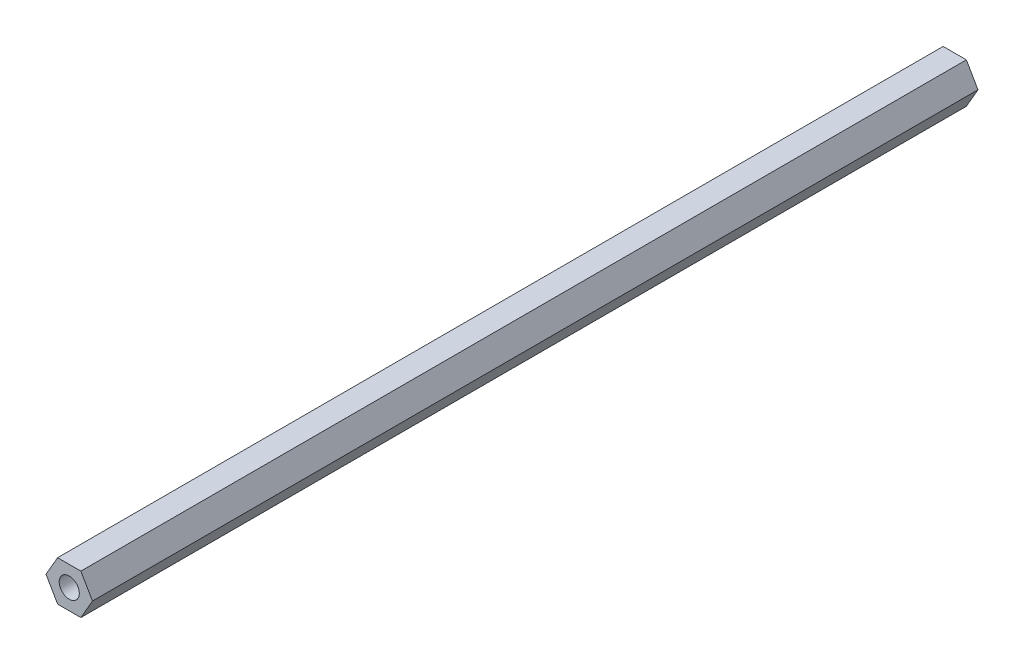
ISO-10303-21;
HEADER;
FILE_DESCRIPTION(('STEP AP214'),'2;1');
FILE_NAME('part.step','',(''),(''),'','','');
FILE_SCHEMA(('AUTOMOTIVE_DESIGN { 1 0 10303 214 1 1 1 1 }'));
ENDSEC;
DATA;
#1=APPLICATION_CONTEXT('core data for automotive mechanical design processes');
#2=APPLICATION_PROTOCOL_DEFINITION('international standard','automotive_design',2000,#1);
#3=PRODUCT_CONTEXT('',#1,'mechanical');
#4=PRODUCT('Part','Part','',(#3));
#5=PRODUCT_RELATED_PRODUCT_CATEGORY('part','',(#4));
#6=PRODUCT_DEFINITION_FORMATION('','',#4);
#7=PRODUCT_DEFINITION_CONTEXT('part definition',#1,'design');
#8=PRODUCT_DEFINITION('design','',#6,#7);
#9=PRODUCT_DEFINITION_SHAPE('','',#8);
#10=(LENGTH_UNIT() NAMED_UNIT(*) SI_UNIT(.MILLI.,.METRE.));
#11=(NAMED_UNIT(*) PLANE_ANGLE_UNIT() SI_UNIT($,.RADIAN.));
#12=(NAMED_UNIT(*) SI_UNIT($,.STERADIAN.) SOLID_ANGLE_UNIT());
#13=UNCERTAINTY_MEASURE_WITH_UNIT(LENGTH_MEASURE(1.E-05),#10,'distance_accuracy_value','');
#14=(GEOMETRIC_REPRESENTATION_CONTEXT(3) GLOBAL_UNCERTAINTY_ASSIGNED_CONTEXT((#13)) GLOBAL_UNIT_ASSIGNED_CONTEXT((#10,
#11,#12)) REPRESENTATION_CONTEXT('',''));
#15=CARTESIAN_POINT('',(0.,0.,0.));
#16=DIRECTION('',(0.,0.,1.));
#17=DIRECTION('',(1.,0.,0.));
#18=AXIS2_PLACEMENT_3D('',#15,#16,#17);
#19=CARTESIAN_POINT('',(0.,0.,279.4));
#20=DIRECTION('',(0.,0.,1.));
#21=DIRECTION('',(1.,0.,0.));
#22=AXIS2_PLACEMENT_3D('',#19,#20,#21);
#23=PLANE('',#22);
#24=DIRECTION('',(-0.499999999999995,-0.866025403784441,0.));
#25=VECTOR('',#24,1.);
#26=CARTESIAN_POINT('',(-3.6661742093542,6.34999999999996,279.4));
#27=LINE('',#26,#25);
#28=CARTESIAN_POINT('',(-3.6661742093542,6.34999999999996,279.4));
#29=VERTEX_POINT('',#28);
#30=CARTESIAN_POINT('',(-7.33234841870825,0.,279.4));
#31=VERTEX_POINT('',#30);
#32=EDGE_CURVE('E139',#29,#31,#27,.T.);
#33=ORIENTED_EDGE('',*,*,#32,.T.);
#34=DIRECTION('',(0.500000000000001,-0.866025403784438,0.));
#35=VECTOR('',#34,1.);
#36=CARTESIAN_POINT('',(-7.33234841870825,0.,279.4));
#37=LINE('',#36,#35);
#38=CARTESIAN_POINT('',(-3.66617420935411,-6.35000000000001,279.4));
#39=VERTEX_POINT('',#38);
#40=EDGE_CURVE('E97',#31,#39,#37,.T.);
#41=ORIENTED_EDGE('',*,*,#40,.T.);
#42=DIRECTION('',(1.,0.,0.));
#43=VECTOR('',#42,1.);
#44=CARTESIAN_POINT('',(-3.66617420935411,-6.35000000000001,279.4));
#45=LINE('',#44,#43);
#46=CARTESIAN_POINT('',(3.66617420935415,-6.34999999999999,279.4));
#47=VERTEX_POINT('',#46);
#48=EDGE_CURVE('E110',#39,#47,#45,.T.);
#49=ORIENTED_EDGE('',*,*,#48,.T.);
#50=DIRECTION('',(0.499999999999995,0.866025403784442,0.));
#51=VECTOR('',#50,1.);
#52=CARTESIAN_POINT('',(3.66617420935415,-6.34999999999999,279.4));
#53=LINE('',#52,#51);
#54=CARTESIAN_POINT('',(7.33234841870825,0.,279.4));
#55=VERTEX_POINT('',#54);
#56=EDGE_CURVE('E104',#47,#55,#53,.T.);
#57=ORIENTED_EDGE('',*,*,#56,.T.);
#58=DIRECTION('',(-0.500000000000007,0.866025403784435,0.));
#59=VECTOR('',#58,1.);
#60=CARTESIAN_POINT('',(7.33234841870825,0.,279.4));
#61=LINE('',#60,#59);
#62=CARTESIAN_POINT('',(3.66617420935407,6.35000000000004,279.4));
#63=VERTEX_POINT('',#62);
#64=EDGE_CURVE('E108',#55,#63,#61,.T.);
#65=ORIENTED_EDGE('',*,*,#64,.T.);
#66=DIRECTION('',(-1.,0.,0.));
#67=VECTOR('',#66,1.);
#68=CARTESIAN_POINT('',(3.66617420935407,6.35000000000004,279.4));
#69=LINE('',#68,#67);
#70=EDGE_CURVE('E60',#63,#29,#69,.T.);
#71=ORIENTED_EDGE('',*,*,#70,.T.);
#72=EDGE_LOOP('',(#33,#41,#49,#57,#65,#71));
#73=FACE_BOUND('',#72,.T.);
#74=CARTESIAN_POINT('',(0.,0.,279.4));
#75=DIRECTION('',(0.,0.,1.));
#76=DIRECTION('',(1.,0.,0.));
#77=AXIS2_PLACEMENT_3D('',#74,#75,#76);
#78=CIRCLE('',#77,3.175);
#79=CARTESIAN_POINT('',(3.175,0.,279.4));
#80=VERTEX_POINT('',#79);
#81=EDGE_CURVE('E132',#80,#80,#78,.T.);
#82=ORIENTED_EDGE('',*,*,#81,.F.);
#83=EDGE_LOOP('',(#82));
#84=FACE_BOUND('',#83,.T.);
#85=ADVANCED_FACE('F43',(#73,#84),#23,.T.);
#86=CARTESIAN_POINT('',(0.,0.,0.));
#87=DIRECTION('',(0.,0.,1.));
#88=DIRECTION('',(1.,0.,0.));
#89=AXIS2_PLACEMENT_3D('',#86,#87,#88);
#90=PLANE('',#89);
#91=DIRECTION('',(-0.499999999999995,-0.866025403784441,0.));
#92=VECTOR('',#91,1.);
#93=CARTESIAN_POINT('',(-3.6661742093542,6.34999999999996,0.));
#94=LINE('',#93,#92);
#95=CARTESIAN_POINT('',(-3.6661742093542,6.34999999999996,0.));
#96=VERTEX_POINT('',#95);
#97=CARTESIAN_POINT('',(-7.33234841870825,0.,0.));
#98=VERTEX_POINT('',#97);
#99=EDGE_CURVE('E128',#96,#98,#94,.T.);
#100=ORIENTED_EDGE('',*,*,#99,.F.);
#101=DIRECTION('',(-1.,0.,0.));
#102=VECTOR('',#101,1.);
#103=CARTESIAN_POINT('',(3.66617420935407,6.35000000000004,0.));
#104=LINE('',#103,#102);
#105=CARTESIAN_POINT('',(3.66617420935407,6.35000000000004,0.));
#106=VERTEX_POINT('',#105);
#107=EDGE_CURVE('E89',#106,#96,#104,.T.);
#108=ORIENTED_EDGE('',*,*,#107,.F.);
#109=DIRECTION('',(-0.500000000000007,0.866025403784435,0.));
#110=VECTOR('',#109,1.);
#111=CARTESIAN_POINT('',(7.33234841870825,0.,0.));
#112=LINE('',#111,#110);
#113=CARTESIAN_POINT('',(7.33234841870825,0.,0.));
#114=VERTEX_POINT('',#113);
#115=EDGE_CURVE('E83',#114,#106,#112,.T.);
#116=ORIENTED_EDGE('',*,*,#115,.F.);
#117=DIRECTION('',(0.499999999999995,0.866025403784442,0.));
#118=VECTOR('',#117,1.);
#119=CARTESIAN_POINT('',(3.66617420935415,-6.34999999999999,0.));
#120=LINE('',#119,#118);
#121=CARTESIAN_POINT('',(3.66617420935415,-6.34999999999999,0.));
#122=VERTEX_POINT('',#121);
#123=EDGE_CURVE('E118',#122,#114,#120,.T.);
#124=ORIENTED_EDGE('',*,*,#123,.F.);
#125=DIRECTION('',(1.,0.,0.));
#126=VECTOR('',#125,1.);
#127=CARTESIAN_POINT('',(-3.66617420935411,-6.35000000000001,0.));
#128=LINE('',#127,#126);
#129=CARTESIAN_POINT('',(-3.66617420935411,-6.35000000000001,0.));
#130=VERTEX_POINT('',#129);
#131=EDGE_CURVE('E134',#130,#122,#128,.T.);
#132=ORIENTED_EDGE('',*,*,#131,.F.);
#133=DIRECTION('',(0.500000000000001,-0.866025403784438,0.));
#134=VECTOR('',#133,1.);
#135=CARTESIAN_POINT('',(-7.33234841870825,0.,0.));
#136=LINE('',#135,#134);
#137=EDGE_CURVE('E131',#98,#130,#136,.T.);
#138=ORIENTED_EDGE('',*,*,#137,.F.);
#139=EDGE_LOOP('',(#100,#108,#116,#124,#132,#138));
#140=FACE_BOUND('',#139,.T.);
#141=CARTESIAN_POINT('',(0.,0.,0.));
#142=DIRECTION('',(0.,0.,1.));
#143=DIRECTION('',(1.,0.,0.));
#144=AXIS2_PLACEMENT_3D('',#141,#142,#143);
#145=CIRCLE('',#144,3.175);
#146=CARTESIAN_POINT('',(3.175,0.,0.));
#147=VERTEX_POINT('',#146);
#148=EDGE_CURVE('E232',#147,#147,#145,.T.);
#149=ORIENTED_EDGE('',*,*,#148,.T.);
#150=EDGE_LOOP('',(#149));
#151=FACE_BOUND('',#150,.T.);
#152=ADVANCED_FACE('F148',(#140,#151),#90,.F.);
#153=CARTESIAN_POINT('',(-3.6661742093542,6.34999999999996,279.4));
#154=DIRECTION('',(0.866025403784441,-0.499999999999995,0.));
#155=DIRECTION('',(0.499999999999995,0.866025403784441,0.));
#156=AXIS2_PLACEMENT_3D('',#153,#154,#155);
#157=PLANE('',#156);
#158=ORIENTED_EDGE('',*,*,#99,.T.);
#159=DIRECTION('',(0.,0.,-1.));
#160=VECTOR('',#159,1.);
#161=CARTESIAN_POINT('',(-7.33234841870825,0.,279.4));
#162=LINE('',#161,#160);
#163=EDGE_CURVE('E11',#31,#98,#162,.T.);
#164=ORIENTED_EDGE('',*,*,#163,.F.);
#165=ORIENTED_EDGE('',*,*,#32,.F.);
#166=DIRECTION('',(0.,0.,-1.));
#167=VECTOR('',#166,1.);
#168=CARTESIAN_POINT('',(-3.6661742093542,6.34999999999996,279.4));
#169=LINE('',#168,#167);
#170=EDGE_CURVE('E124',#29,#96,#169,.T.);
#171=ORIENTED_EDGE('',*,*,#170,.T.);
#172=EDGE_LOOP('',(#158,#164,#165,#171));
#173=FACE_BOUND('',#172,.T.);
#174=ADVANCED_FACE('F45',(#173),#157,.F.);
#175=CARTESIAN_POINT('',(-7.33234841870825,0.,279.4));
#176=DIRECTION('',(0.866025403784438,0.500000000000001,0.));
#177=DIRECTION('',(-0.500000000000001,0.866025403784438,0.));
#178=AXIS2_PLACEMENT_3D('',#175,#176,#177);
#179=PLANE('',#178);
#180=ORIENTED_EDGE('',*,*,#137,.T.);
#181=DIRECTION('',(0.,0.,-1.));
#182=VECTOR('',#181,1.);
#183=CARTESIAN_POINT('',(-3.66617420935411,-6.35000000000001,279.4));
#184=LINE('',#183,#182);
#185=EDGE_CURVE('E52',#39,#130,#184,.T.);
#186=ORIENTED_EDGE('',*,*,#185,.F.);
#187=ORIENTED_EDGE('',*,*,#40,.F.);
#188=ORIENTED_EDGE('',*,*,#163,.T.);
#189=EDGE_LOOP('',(#180,#186,#187,#188));
#190=FACE_BOUND('',#189,.T.);
#191=ADVANCED_FACE('F173',(#190),#179,.F.);
#192=CARTESIAN_POINT('',(-3.66617420935411,-6.35000000000001,279.4));
#193=DIRECTION('',(0.,1.,0.));
#194=DIRECTION('',(-1.,0.,0.));
#195=AXIS2_PLACEMENT_3D('',#192,#193,#194);
#196=PLANE('',#195);
#197=ORIENTED_EDGE('',*,*,#131,.T.);
#198=DIRECTION('',(0.,0.,-1.));
#199=VECTOR('',#198,1.);
#200=CARTESIAN_POINT('',(3.66617420935415,-6.34999999999999,279.4));
#201=LINE('',#200,#199);
#202=EDGE_CURVE('E119',#47,#122,#201,.T.);
#203=ORIENTED_EDGE('',*,*,#202,.F.);
#204=ORIENTED_EDGE('',*,*,#48,.F.);
#205=ORIENTED_EDGE('',*,*,#185,.T.);
#206=EDGE_LOOP('',(#197,#203,#204,#205));
#207=FACE_BOUND('',#206,.T.);
#208=ADVANCED_FACE('F145',(#207),#196,.F.);
#209=CARTESIAN_POINT('',(3.66617420935415,-6.34999999999999,279.4));
#210=DIRECTION('',(-0.866025403784442,0.499999999999995,0.));
#211=DIRECTION('',(-0.499999999999995,-0.866025403784442,0.));
#212=AXIS2_PLACEMENT_3D('',#209,#210,#211);
#213=PLANE('',#212);
#214=ORIENTED_EDGE('',*,*,#123,.T.);
#215=DIRECTION('',(0.,0.,-1.));
#216=VECTOR('',#215,1.);
#217=CARTESIAN_POINT('',(7.33234841870825,0.,279.4));
#218=LINE('',#217,#216);
#219=EDGE_CURVE('E115',#55,#114,#218,.T.);
#220=ORIENTED_EDGE('',*,*,#219,.F.);
#221=ORIENTED_EDGE('',*,*,#56,.F.);
#222=ORIENTED_EDGE('',*,*,#202,.T.);
#223=EDGE_LOOP('',(#214,#220,#221,#222));
#224=FACE_BOUND('',#223,.T.);
#225=ADVANCED_FACE('F116',(#224),#213,.F.);
#226=CARTESIAN_POINT('',(7.33234841870825,0.,279.4));
#227=DIRECTION('',(-0.866025403784435,-0.500000000000007,0.));
#228=DIRECTION('',(0.500000000000007,-0.866025403784435,0.));
#229=AXIS2_PLACEMENT_3D('',#226,#227,#228);
#230=PLANE('',#229);
#231=ORIENTED_EDGE('',*,*,#115,.T.);
#232=DIRECTION('',(0.,0.,-1.));
#233=VECTOR('',#232,1.);
#234=CARTESIAN_POINT('',(3.66617420935407,6.35000000000004,279.4));
#235=LINE('',#234,#233);
#236=EDGE_CURVE('E120',#63,#106,#235,.T.);
#237=ORIENTED_EDGE('',*,*,#236,.F.);
#238=ORIENTED_EDGE('',*,*,#64,.F.);
#239=ORIENTED_EDGE('',*,*,#219,.T.);
#240=EDGE_LOOP('',(#231,#237,#238,#239));
#241=FACE_BOUND('',#240,.T.);
#242=ADVANCED_FACE('F122',(#241),#230,.F.);
#243=CARTESIAN_POINT('',(3.66617420935407,6.35000000000004,279.4));
#244=DIRECTION('',(0.,-1.,0.));
#245=DIRECTION('',(1.,0.,0.));
#246=AXIS2_PLACEMENT_3D('',#243,#244,#245);
#247=PLANE('',#246);
#248=ORIENTED_EDGE('',*,*,#107,.T.);
#249=ORIENTED_EDGE('',*,*,#170,.F.);
#250=ORIENTED_EDGE('',*,*,#70,.F.);
#251=ORIENTED_EDGE('',*,*,#236,.T.);
#252=EDGE_LOOP('',(#248,#249,#250,#251));
#253=FACE_BOUND('',#252,.T.);
#254=ADVANCED_FACE('F153',(#253),#247,.F.);
#255=CARTESIAN_POINT('',(0.,0.,279.4));
#256=DIRECTION('',(0.,0.,-1.));
#257=DIRECTION('',(-1.,0.,0.));
#258=AXIS2_PLACEMENT_3D('',#255,#256,#257);
#259=CYLINDRICAL_SURFACE('',#258,3.175);
#260=ORIENTED_EDGE('',*,*,#81,.T.);
#261=EDGE_LOOP('',(#260));
#262=FACE_BOUND('',#261,.T.);
#263=ORIENTED_EDGE('',*,*,#148,.F.);
#264=EDGE_LOOP('',(#263));
#265=FACE_BOUND('',#264,.T.);
#266=ADVANCED_FACE('F155',(#262,#265),#259,.F.);
#267=CLOSED_SHELL('',(#85,#152,#174,#191,#208,#225,#242,#254,#266));
#268=MANIFOLD_SOLID_BREP('B2',#267);
#269=ADVANCED_BREP_SHAPE_REPRESENTATION('',(#18,#268),#14);
#270=SHAPE_DEFINITION_REPRESENTATION(#9,#269);
ENDSEC;
END-ISO-10303-21;
